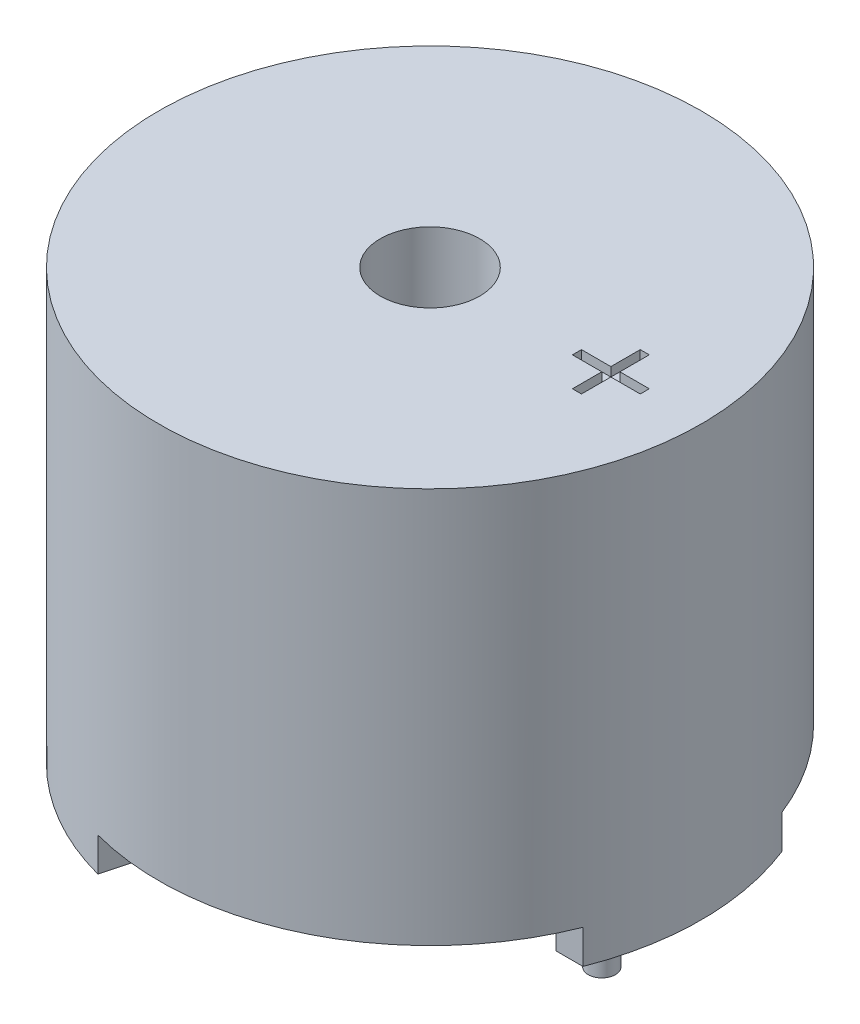
ISO-10303-21;
HEADER;
FILE_DESCRIPTION(('STEP AP214'),'2;1');
FILE_NAME('part.step','',(''),(''),'','','');
FILE_SCHEMA(('AUTOMOTIVE_DESIGN { 1 0 10303 214 1 1 1 1 }'));
ENDSEC;
DATA;
#1=APPLICATION_CONTEXT('core data for automotive mechanical design processes');
#2=APPLICATION_PROTOCOL_DEFINITION('international standard','automotive_design',2000,#1);
#3=PRODUCT_CONTEXT('',#1,'mechanical');
#4=PRODUCT('Part','Part','',(#3));
#5=PRODUCT_RELATED_PRODUCT_CATEGORY('part','',(#4));
#6=PRODUCT_DEFINITION_FORMATION('','',#4);
#7=PRODUCT_DEFINITION_CONTEXT('part definition',#1,'design');
#8=PRODUCT_DEFINITION('design','',#6,#7);
#9=PRODUCT_DEFINITION_SHAPE('','',#8);
#10=(LENGTH_UNIT() NAMED_UNIT(*) SI_UNIT(.MILLI.,.METRE.));
#11=(NAMED_UNIT(*) PLANE_ANGLE_UNIT() SI_UNIT($,.RADIAN.));
#12=(NAMED_UNIT(*) SI_UNIT($,.STERADIAN.) SOLID_ANGLE_UNIT());
#13=UNCERTAINTY_MEASURE_WITH_UNIT(LENGTH_MEASURE(1.E-05),#10,'distance_accuracy_value','');
#14=(GEOMETRIC_REPRESENTATION_CONTEXT(3) GLOBAL_UNCERTAINTY_ASSIGNED_CONTEXT((#13)) GLOBAL_UNIT_ASSIGNED_CONTEXT((#10,
#11,#12)) REPRESENTATION_CONTEXT('',''));
#15=CARTESIAN_POINT('',(0.,0.,0.));
#16=DIRECTION('',(0.,0.,1.));
#17=DIRECTION('',(1.,0.,0.));
#18=AXIS2_PLACEMENT_3D('',#15,#16,#17);
#19=CARTESIAN_POINT('',(0.,9.3,0.));
#20=DIRECTION('',(0.,1.,0.));
#21=DIRECTION('',(0.,0.,1.));
#22=AXIS2_PLACEMENT_3D('',#19,#20,#21);
#23=PLANE('',#22);
#24=DIRECTION('',(0.,0.,-1.));
#25=VECTOR('',#24,1.);
#26=CARTESIAN_POINT('',(4.1,9.3,0.75));
#27=LINE('',#26,#25);
#28=CARTESIAN_POINT('',(4.1,9.3,0.75));
#29=VERTEX_POINT('',#28);
#30=CARTESIAN_POINT('',(4.1,9.3,0.1));
#31=VERTEX_POINT('',#30);
#32=EDGE_CURVE('E268',#29,#31,#27,.T.);
#33=ORIENTED_EDGE('',*,*,#32,.T.);
#34=DIRECTION('',(1.,0.,0.));
#35=VECTOR('',#34,1.);
#36=CARTESIAN_POINT('',(4.75,9.3,0.1));
#37=LINE('',#36,#35);
#38=CARTESIAN_POINT('',(4.75,9.3,0.1));
#39=VERTEX_POINT('',#38);
#40=EDGE_CURVE('E273',#31,#39,#37,.T.);
#41=ORIENTED_EDGE('',*,*,#40,.T.);
#42=DIRECTION('',(0.,0.,-1.));
#43=VECTOR('',#42,1.);
#44=CARTESIAN_POINT('',(4.75,9.3,0.1));
#45=LINE('',#44,#43);
#46=CARTESIAN_POINT('',(4.75,9.3,-0.1));
#47=VERTEX_POINT('',#46);
#48=EDGE_CURVE('E275',#39,#47,#45,.T.);
#49=ORIENTED_EDGE('',*,*,#48,.T.);
#50=DIRECTION('',(-1.,0.,0.));
#51=VECTOR('',#50,1.);
#52=CARTESIAN_POINT('',(4.75,9.3,-0.1));
#53=LINE('',#52,#51);
#54=CARTESIAN_POINT('',(4.1,9.3,-0.1));
#55=VERTEX_POINT('',#54);
#56=EDGE_CURVE('E85',#47,#55,#53,.T.);
#57=ORIENTED_EDGE('',*,*,#56,.T.);
#58=DIRECTION('',(0.,0.,-1.));
#59=VECTOR('',#58,1.);
#60=CARTESIAN_POINT('',(4.1,9.3,-0.1));
#61=LINE('',#60,#59);
#62=CARTESIAN_POINT('',(4.1,9.3,-0.75));
#63=VERTEX_POINT('',#62);
#64=EDGE_CURVE('E228',#55,#63,#61,.T.);
#65=ORIENTED_EDGE('',*,*,#64,.T.);
#66=DIRECTION('',(-1.,0.,0.));
#67=VECTOR('',#66,1.);
#68=CARTESIAN_POINT('',(4.1,9.3,-0.75));
#69=LINE('',#68,#67);
#70=CARTESIAN_POINT('',(3.9,9.3,-0.75));
#71=VERTEX_POINT('',#70);
#72=EDGE_CURVE('E233',#63,#71,#69,.T.);
#73=ORIENTED_EDGE('',*,*,#72,.T.);
#74=DIRECTION('',(0.,0.,1.));
#75=VECTOR('',#74,1.);
#76=CARTESIAN_POINT('',(3.9,9.3,-0.1));
#77=LINE('',#76,#75);
#78=CARTESIAN_POINT('',(3.9,9.3,-0.1));
#79=VERTEX_POINT('',#78);
#80=EDGE_CURVE('E238',#71,#79,#77,.T.);
#81=ORIENTED_EDGE('',*,*,#80,.T.);
#82=DIRECTION('',(-1.,0.,0.));
#83=VECTOR('',#82,1.);
#84=CARTESIAN_POINT('',(3.9,9.3,-0.1));
#85=LINE('',#84,#83);
#86=CARTESIAN_POINT('',(3.25,9.3,-0.1));
#87=VERTEX_POINT('',#86);
#88=EDGE_CURVE('E243',#79,#87,#85,.T.);
#89=ORIENTED_EDGE('',*,*,#88,.T.);
#90=DIRECTION('',(0.,0.,1.));
#91=VECTOR('',#90,1.);
#92=CARTESIAN_POINT('',(3.25,9.3,0.1));
#93=LINE('',#92,#91);
#94=CARTESIAN_POINT('',(3.25,9.3,0.1));
#95=VERTEX_POINT('',#94);
#96=EDGE_CURVE('E248',#87,#95,#93,.T.);
#97=ORIENTED_EDGE('',*,*,#96,.T.);
#98=DIRECTION('',(1.,0.,0.));
#99=VECTOR('',#98,1.);
#100=CARTESIAN_POINT('',(3.9,9.3,0.1));
#101=LINE('',#100,#99);
#102=CARTESIAN_POINT('',(3.9,9.3,0.1));
#103=VERTEX_POINT('',#102);
#104=EDGE_CURVE('E253',#95,#103,#101,.T.);
#105=ORIENTED_EDGE('',*,*,#104,.T.);
#106=DIRECTION('',(0.,0.,1.));
#107=VECTOR('',#106,1.);
#108=CARTESIAN_POINT('',(3.9,9.3,0.75));
#109=LINE('',#108,#107);
#110=CARTESIAN_POINT('',(3.9,9.3,0.75));
#111=VERTEX_POINT('',#110);
#112=EDGE_CURVE('E258',#103,#111,#109,.T.);
#113=ORIENTED_EDGE('',*,*,#112,.T.);
#114=DIRECTION('',(1.,0.,0.));
#115=VECTOR('',#114,1.);
#116=CARTESIAN_POINT('',(4.1,9.3,0.75));
#117=LINE('',#116,#115);
#118=EDGE_CURVE('E263',#111,#29,#117,.T.);
#119=ORIENTED_EDGE('',*,*,#118,.T.);
#120=EDGE_LOOP('',(#33,#41,#49,#57,#65,#73,#81,#89,#97,#105,#113,#119));
#121=FACE_BOUND('',#120,.T.);
#122=ADVANCED_FACE('F19',(#121),#23,.T.);
#123=CARTESIAN_POINT('',(0.,6.5,0.));
#124=DIRECTION('',(0.,1.,0.));
#125=DIRECTION('',(0.,0.,1.));
#126=AXIS2_PLACEMENT_3D('',#123,#124,#125);
#127=PLANE('',#126);
#128=CARTESIAN_POINT('',(0.,6.5,0.));
#129=DIRECTION('',(0.,1.,0.));
#130=DIRECTION('',(0.,0.,1.));
#131=AXIS2_PLACEMENT_3D('',#128,#129,#130);
#132=CIRCLE('',#131,1.1);
#133=CARTESIAN_POINT('',(0.,6.5,1.1));
#134=VERTEX_POINT('',#133);
#135=EDGE_CURVE('E22',#134,#134,#132,.T.);
#136=ORIENTED_EDGE('',*,*,#135,.T.);
#137=EDGE_LOOP('',(#136));
#138=FACE_BOUND('',#137,.T.);
#139=ADVANCED_FACE('F321',(#138),#127,.T.);
#140=CARTESIAN_POINT('',(3.8,-2.,0.));
#141=DIRECTION('',(0.,-1.,0.));
#142=DIRECTION('',(0.,0.,-1.));
#143=AXIS2_PLACEMENT_3D('',#140,#141,#142);
#144=PLANE('',#143);
#145=CARTESIAN_POINT('',(3.8,-2.,0.));
#146=DIRECTION('',(0.,-1.,0.));
#147=DIRECTION('',(0.,0.,-1.));
#148=AXIS2_PLACEMENT_3D('',#145,#146,#147);
#149=CIRCLE('',#148,0.3);
#150=CARTESIAN_POINT('',(3.8,-2.,-0.3));
#151=VERTEX_POINT('',#150);
#152=EDGE_CURVE('E314',#151,#151,#149,.F.);
#153=ORIENTED_EDGE('',*,*,#152,.F.);
#154=EDGE_LOOP('',(#153));
#155=FACE_BOUND('',#154,.T.);
#156=ADVANCED_FACE('F631',(#155),#144,.T.);
#157=CARTESIAN_POINT('',(-3.8,-2.,0.));
#158=DIRECTION('',(0.,-1.,0.));
#159=DIRECTION('',(0.,0.,-1.));
#160=AXIS2_PLACEMENT_3D('',#157,#158,#159);
#161=PLANE('',#160);
#162=CARTESIAN_POINT('',(-3.8,-2.,0.));
#163=DIRECTION('',(0.,1.,0.));
#164=DIRECTION('',(0.,0.,1.));
#165=AXIS2_PLACEMENT_3D('',#162,#163,#164);
#166=CIRCLE('',#165,0.3);
#167=CARTESIAN_POINT('',(-3.8,-2.,0.299999999999999));
#168=VERTEX_POINT('',#167);
#169=EDGE_CURVE('E216',#168,#168,#166,.T.);
#170=ORIENTED_EDGE('',*,*,#169,.F.);
#171=EDGE_LOOP('',(#170));
#172=FACE_BOUND('',#171,.T.);
#173=ADVANCED_FACE('F622',(#172),#161,.T.);
#174=CARTESIAN_POINT('',(4.75,9.3,0.1));
#175=DIRECTION('',(1.,0.,0.));
#176=DIRECTION('',(0.,0.,-1.));
#177=AXIS2_PLACEMENT_3D('',#174,#175,#176);
#178=PLANE('',#177);
#179=DIRECTION('',(0.,1.,0.));
#180=VECTOR('',#179,1.);
#181=CARTESIAN_POINT('',(4.75,9.3,-0.1));
#182=LINE('',#181,#180);
#183=CARTESIAN_POINT('',(4.75,9.5,-0.1));
#184=VERTEX_POINT('',#183);
#185=EDGE_CURVE('E222',#184,#47,#182,.F.);
#186=ORIENTED_EDGE('',*,*,#185,.T.);
#187=ORIENTED_EDGE('',*,*,#48,.F.);
#188=DIRECTION('',(0.,1.,0.));
#189=VECTOR('',#188,1.);
#190=CARTESIAN_POINT('',(4.75,9.3,0.1));
#191=LINE('',#190,#189);
#192=CARTESIAN_POINT('',(4.75,9.5,0.1));
#193=VERTEX_POINT('',#192);
#194=EDGE_CURVE('E270',#39,#193,#191,.T.);
#195=ORIENTED_EDGE('',*,*,#194,.T.);
#196=DIRECTION('',(0.,0.,1.));
#197=VECTOR('',#196,1.);
#198=CARTESIAN_POINT('',(4.75,9.5,0.));
#199=LINE('',#198,#197);
#200=EDGE_CURVE('E166',#184,#193,#199,.T.);
#201=ORIENTED_EDGE('',*,*,#200,.F.);
#202=EDGE_LOOP('',(#186,#187,#195,#201));
#203=FACE_BOUND('',#202,.T.);
#204=ADVANCED_FACE('F613',(#203),#178,.F.);
#205=CARTESIAN_POINT('',(4.75,9.3,0.1));
#206=DIRECTION('',(0.,0.,1.));
#207=DIRECTION('',(1.,0.,0.));
#208=AXIS2_PLACEMENT_3D('',#205,#206,#207);
#209=PLANE('',#208);
#210=ORIENTED_EDGE('',*,*,#194,.F.);
#211=ORIENTED_EDGE('',*,*,#40,.F.);
#212=DIRECTION('',(0.,1.,0.));
#213=VECTOR('',#212,1.);
#214=CARTESIAN_POINT('',(4.1,9.3,0.1));
#215=LINE('',#214,#213);
#216=CARTESIAN_POINT('',(4.1,9.5,0.1));
#217=VERTEX_POINT('',#216);
#218=EDGE_CURVE('E265',#31,#217,#215,.T.);
#219=ORIENTED_EDGE('',*,*,#218,.T.);
#220=DIRECTION('',(1.,0.,0.));
#221=VECTOR('',#220,1.);
#222=CARTESIAN_POINT('',(0.,9.5,0.1));
#223=LINE('',#222,#221);
#224=EDGE_CURVE('E693',#193,#217,#223,.F.);
#225=ORIENTED_EDGE('',*,*,#224,.F.);
#226=EDGE_LOOP('',(#210,#211,#219,#225));
#227=FACE_BOUND('',#226,.T.);
#228=ADVANCED_FACE('F604',(#227),#209,.F.);
#229=CARTESIAN_POINT('',(4.1,9.3,0.75));
#230=DIRECTION('',(1.,0.,0.));
#231=DIRECTION('',(0.,0.,-1.));
#232=AXIS2_PLACEMENT_3D('',#229,#230,#231);
#233=PLANE('',#232);
#234=ORIENTED_EDGE('',*,*,#218,.F.);
#235=ORIENTED_EDGE('',*,*,#32,.F.);
#236=DIRECTION('',(0.,1.,0.));
#237=VECTOR('',#236,1.);
#238=CARTESIAN_POINT('',(4.1,9.3,0.75));
#239=LINE('',#238,#237);
#240=CARTESIAN_POINT('',(4.1,9.5,0.75));
#241=VERTEX_POINT('',#240);
#242=EDGE_CURVE('E260',#29,#241,#239,.T.);
#243=ORIENTED_EDGE('',*,*,#242,.T.);
#244=DIRECTION('',(0.,0.,1.));
#245=VECTOR('',#244,1.);
#246=CARTESIAN_POINT('',(4.1,9.5,0.));
#247=LINE('',#246,#245);
#248=EDGE_CURVE('E685',#217,#241,#247,.T.);
#249=ORIENTED_EDGE('',*,*,#248,.F.);
#250=EDGE_LOOP('',(#234,#235,#243,#249));
#251=FACE_BOUND('',#250,.T.);
#252=ADVANCED_FACE('F595',(#251),#233,.F.);
#253=CARTESIAN_POINT('',(4.1,9.3,0.75));
#254=DIRECTION('',(0.,0.,1.));
#255=DIRECTION('',(1.,0.,0.));
#256=AXIS2_PLACEMENT_3D('',#253,#254,#255);
#257=PLANE('',#256);
#258=ORIENTED_EDGE('',*,*,#242,.F.);
#259=ORIENTED_EDGE('',*,*,#118,.F.);
#260=DIRECTION('',(0.,1.,0.));
#261=VECTOR('',#260,1.);
#262=CARTESIAN_POINT('',(3.9,9.3,0.75));
#263=LINE('',#262,#261);
#264=CARTESIAN_POINT('',(3.9,9.5,0.75));
#265=VERTEX_POINT('',#264);
#266=EDGE_CURVE('E255',#111,#265,#263,.T.);
#267=ORIENTED_EDGE('',*,*,#266,.T.);
#268=DIRECTION('',(1.,0.,0.));
#269=VECTOR('',#268,1.);
#270=CARTESIAN_POINT('',(0.,9.5,0.75));
#271=LINE('',#270,#269);
#272=EDGE_CURVE('E692',#241,#265,#271,.F.);
#273=ORIENTED_EDGE('',*,*,#272,.F.);
#274=EDGE_LOOP('',(#258,#259,#267,#273));
#275=FACE_BOUND('',#274,.T.);
#276=ADVANCED_FACE('F586',(#275),#257,.F.);
#277=CARTESIAN_POINT('',(3.9,9.3,0.75));
#278=DIRECTION('',(-1.,0.,0.));
#279=DIRECTION('',(0.,0.,1.));
#280=AXIS2_PLACEMENT_3D('',#277,#278,#279);
#281=PLANE('',#280);
#282=ORIENTED_EDGE('',*,*,#266,.F.);
#283=ORIENTED_EDGE('',*,*,#112,.F.);
#284=DIRECTION('',(0.,1.,0.));
#285=VECTOR('',#284,1.);
#286=CARTESIAN_POINT('',(3.9,9.3,0.1));
#287=LINE('',#286,#285);
#288=CARTESIAN_POINT('',(3.9,9.5,0.1));
#289=VERTEX_POINT('',#288);
#290=EDGE_CURVE('E250',#103,#289,#287,.T.);
#291=ORIENTED_EDGE('',*,*,#290,.T.);
#292=DIRECTION('',(0.,0.,1.));
#293=VECTOR('',#292,1.);
#294=CARTESIAN_POINT('',(3.9,9.5,0.));
#295=LINE('',#294,#293);
#296=EDGE_CURVE('E700',#265,#289,#295,.F.);
#297=ORIENTED_EDGE('',*,*,#296,.F.);
#298=EDGE_LOOP('',(#282,#283,#291,#297));
#299=FACE_BOUND('',#298,.T.);
#300=ADVANCED_FACE('F577',(#299),#281,.F.);
#301=CARTESIAN_POINT('',(3.9,9.3,0.1));
#302=DIRECTION('',(0.,0.,1.));
#303=DIRECTION('',(1.,0.,0.));
#304=AXIS2_PLACEMENT_3D('',#301,#302,#303);
#305=PLANE('',#304);
#306=ORIENTED_EDGE('',*,*,#290,.F.);
#307=ORIENTED_EDGE('',*,*,#104,.F.);
#308=DIRECTION('',(0.,1.,0.));
#309=VECTOR('',#308,1.);
#310=CARTESIAN_POINT('',(3.25,9.3,0.1));
#311=LINE('',#310,#309);
#312=CARTESIAN_POINT('',(3.25,9.5,0.1));
#313=VERTEX_POINT('',#312);
#314=EDGE_CURVE('E245',#95,#313,#311,.T.);
#315=ORIENTED_EDGE('',*,*,#314,.T.);
#316=DIRECTION('',(1.,0.,0.));
#317=VECTOR('',#316,1.);
#318=CARTESIAN_POINT('',(0.,9.5,0.1));
#319=LINE('',#318,#317);
#320=EDGE_CURVE('E703',#289,#313,#319,.F.);
#321=ORIENTED_EDGE('',*,*,#320,.F.);
#322=EDGE_LOOP('',(#306,#307,#315,#321));
#323=FACE_BOUND('',#322,.T.);
#324=ADVANCED_FACE('F568',(#323),#305,.F.);
#325=CARTESIAN_POINT('',(3.25,9.3,0.1));
#326=DIRECTION('',(-1.,0.,0.));
#327=DIRECTION('',(0.,0.,1.));
#328=AXIS2_PLACEMENT_3D('',#325,#326,#327);
#329=PLANE('',#328);
#330=ORIENTED_EDGE('',*,*,#314,.F.);
#331=ORIENTED_EDGE('',*,*,#96,.F.);
#332=DIRECTION('',(0.,1.,0.));
#333=VECTOR('',#332,1.);
#334=CARTESIAN_POINT('',(3.25,9.3,-0.0999999999999999));
#335=LINE('',#334,#333);
#336=CARTESIAN_POINT('',(3.25,9.5,-0.1));
#337=VERTEX_POINT('',#336);
#338=EDGE_CURVE('E240',#87,#337,#335,.T.);
#339=ORIENTED_EDGE('',*,*,#338,.T.);
#340=DIRECTION('',(0.,0.,1.));
#341=VECTOR('',#340,1.);
#342=CARTESIAN_POINT('',(3.25,9.5,0.));
#343=LINE('',#342,#341);
#344=EDGE_CURVE('E706',#313,#337,#343,.F.);
#345=ORIENTED_EDGE('',*,*,#344,.F.);
#346=EDGE_LOOP('',(#330,#331,#339,#345));
#347=FACE_BOUND('',#346,.T.);
#348=ADVANCED_FACE('F559',(#347),#329,.F.);
#349=CARTESIAN_POINT('',(3.9,9.3,-0.1));
#350=DIRECTION('',(0.,0.,-1.));
#351=DIRECTION('',(-1.,0.,0.));
#352=AXIS2_PLACEMENT_3D('',#349,#350,#351);
#353=PLANE('',#352);
#354=ORIENTED_EDGE('',*,*,#338,.F.);
#355=ORIENTED_EDGE('',*,*,#88,.F.);
#356=DIRECTION('',(0.,1.,0.));
#357=VECTOR('',#356,1.);
#358=CARTESIAN_POINT('',(3.9,9.3,-0.1));
#359=LINE('',#358,#357);
#360=CARTESIAN_POINT('',(3.9,9.5,-0.1));
#361=VERTEX_POINT('',#360);
#362=EDGE_CURVE('E235',#79,#361,#359,.T.);
#363=ORIENTED_EDGE('',*,*,#362,.T.);
#364=DIRECTION('',(1.,0.,0.));
#365=VECTOR('',#364,1.);
#366=CARTESIAN_POINT('',(0.,9.5,-0.1));
#367=LINE('',#366,#365);
#368=EDGE_CURVE('E709',#337,#361,#367,.T.);
#369=ORIENTED_EDGE('',*,*,#368,.F.);
#370=EDGE_LOOP('',(#354,#355,#363,#369));
#371=FACE_BOUND('',#370,.T.);
#372=ADVANCED_FACE('F550',(#371),#353,.F.);
#373=CARTESIAN_POINT('',(3.9,9.3,-0.1));
#374=DIRECTION('',(-1.,0.,0.));
#375=DIRECTION('',(0.,0.,1.));
#376=AXIS2_PLACEMENT_3D('',#373,#374,#375);
#377=PLANE('',#376);
#378=ORIENTED_EDGE('',*,*,#362,.F.);
#379=ORIENTED_EDGE('',*,*,#80,.F.);
#380=DIRECTION('',(0.,1.,0.));
#381=VECTOR('',#380,1.);
#382=CARTESIAN_POINT('',(3.9,9.3,-0.75));
#383=LINE('',#382,#381);
#384=CARTESIAN_POINT('',(3.9,9.5,-0.75));
#385=VERTEX_POINT('',#384);
#386=EDGE_CURVE('E230',#71,#385,#383,.T.);
#387=ORIENTED_EDGE('',*,*,#386,.T.);
#388=DIRECTION('',(0.,0.,1.));
#389=VECTOR('',#388,1.);
#390=CARTESIAN_POINT('',(3.9,9.5,0.));
#391=LINE('',#390,#389);
#392=EDGE_CURVE('E712',#361,#385,#391,.F.);
#393=ORIENTED_EDGE('',*,*,#392,.F.);
#394=EDGE_LOOP('',(#378,#379,#387,#393));
#395=FACE_BOUND('',#394,.T.);
#396=ADVANCED_FACE('F541',(#395),#377,.F.);
#397=CARTESIAN_POINT('',(4.1,9.3,-0.75));
#398=DIRECTION('',(0.,0.,-1.));
#399=DIRECTION('',(-1.,0.,0.));
#400=AXIS2_PLACEMENT_3D('',#397,#398,#399);
#401=PLANE('',#400);
#402=ORIENTED_EDGE('',*,*,#386,.F.);
#403=ORIENTED_EDGE('',*,*,#72,.F.);
#404=DIRECTION('',(0.,1.,0.));
#405=VECTOR('',#404,1.);
#406=CARTESIAN_POINT('',(4.1,9.3,-0.75));
#407=LINE('',#406,#405);
#408=CARTESIAN_POINT('',(4.1,9.5,-0.75));
#409=VERTEX_POINT('',#408);
#410=EDGE_CURVE('E225',#63,#409,#407,.T.);
#411=ORIENTED_EDGE('',*,*,#410,.T.);
#412=DIRECTION('',(1.,0.,0.));
#413=VECTOR('',#412,1.);
#414=CARTESIAN_POINT('',(0.,9.5,-0.75));
#415=LINE('',#414,#413);
#416=EDGE_CURVE('E715',#385,#409,#415,.T.);
#417=ORIENTED_EDGE('',*,*,#416,.F.);
#418=EDGE_LOOP('',(#402,#403,#411,#417));
#419=FACE_BOUND('',#418,.T.);
#420=ADVANCED_FACE('F532',(#419),#401,.F.);
#421=CARTESIAN_POINT('',(4.1,9.3,-0.1));
#422=DIRECTION('',(1.,0.,0.));
#423=DIRECTION('',(0.,0.,-1.));
#424=AXIS2_PLACEMENT_3D('',#421,#422,#423);
#425=PLANE('',#424);
#426=ORIENTED_EDGE('',*,*,#410,.F.);
#427=ORIENTED_EDGE('',*,*,#64,.F.);
#428=DIRECTION('',(0.,1.,0.));
#429=VECTOR('',#428,1.);
#430=CARTESIAN_POINT('',(4.1,9.3,-0.1));
#431=LINE('',#430,#429);
#432=CARTESIAN_POINT('',(4.1,9.5,-0.1));
#433=VERTEX_POINT('',#432);
#434=EDGE_CURVE('E218',#55,#433,#431,.T.);
#435=ORIENTED_EDGE('',*,*,#434,.T.);
#436=DIRECTION('',(0.,0.,1.));
#437=VECTOR('',#436,1.);
#438=CARTESIAN_POINT('',(4.1,9.5,0.));
#439=LINE('',#438,#437);
#440=EDGE_CURVE('E718',#409,#433,#439,.T.);
#441=ORIENTED_EDGE('',*,*,#440,.F.);
#442=EDGE_LOOP('',(#426,#427,#435,#441));
#443=FACE_BOUND('',#442,.T.);
#444=ADVANCED_FACE('F336',(#443),#425,.F.);
#445=CARTESIAN_POINT('',(4.75,9.3,-0.1));
#446=DIRECTION('',(0.,0.,-1.));
#447=DIRECTION('',(-1.,0.,0.));
#448=AXIS2_PLACEMENT_3D('',#445,#446,#447);
#449=PLANE('',#448);
#450=ORIENTED_EDGE('',*,*,#434,.F.);
#451=ORIENTED_EDGE('',*,*,#56,.F.);
#452=ORIENTED_EDGE('',*,*,#185,.F.);
#453=DIRECTION('',(1.,0.,0.));
#454=VECTOR('',#453,1.);
#455=CARTESIAN_POINT('',(0.,9.5,-0.1));
#456=LINE('',#455,#454);
#457=EDGE_CURVE('E311',#433,#184,#456,.T.);
#458=ORIENTED_EDGE('',*,*,#457,.F.);
#459=EDGE_LOOP('',(#450,#451,#452,#458));
#460=FACE_BOUND('',#459,.T.);
#461=ADVANCED_FACE('F326',(#460),#449,.F.);
#462=CARTESIAN_POINT('',(0.,6.5,0.));
#463=DIRECTION('',(0.,1.,0.));
#464=DIRECTION('',(0.,0.,1.));
#465=AXIS2_PLACEMENT_3D('',#462,#463,#464);
#466=CYLINDRICAL_SURFACE('',#465,1.1);
#467=CARTESIAN_POINT('',(0.,9.5,0.));
#468=DIRECTION('',(0.,1.,0.));
#469=DIRECTION('',(0.,0.,1.));
#470=AXIS2_PLACEMENT_3D('',#467,#468,#469);
#471=CIRCLE('',#470,1.1);
#472=CARTESIAN_POINT('',(0.,9.5,1.1));
#473=VERTEX_POINT('',#472);
#474=EDGE_CURVE('E214',#473,#473,#471,.F.);
#475=ORIENTED_EDGE('',*,*,#474,.F.);
#476=EDGE_LOOP('',(#475));
#477=FACE_BOUND('',#476,.T.);
#478=ORIENTED_EDGE('',*,*,#135,.F.);
#479=EDGE_LOOP('',(#478));
#480=FACE_BOUND('',#479,.T.);
#481=ADVANCED_FACE('F323',(#477,#480),#466,.F.);
#482=CARTESIAN_POINT('',(0.,0.,0.));
#483=DIRECTION('',(0.,1.,0.));
#484=DIRECTION('',(0.,0.,1.));
#485=AXIS2_PLACEMENT_3D('',#482,#483,#484);
#486=PLANE('',#485);
#487=CARTESIAN_POINT('',(0.,0.,0.));
#488=DIRECTION('',(0.,-1.,0.));
#489=DIRECTION('',(0.,0.,-1.));
#490=AXIS2_PLACEMENT_3D('',#487,#488,#489);
#491=CIRCLE('',#490,5.446233822217);
#492=CARTESIAN_POINT('',(4.98211429478096,0.,2.2));
#493=VERTEX_POINT('',#492);
#494=CARTESIAN_POINT('',(4.98211429478093,0.,-2.19999999999999));
#495=VERTEX_POINT('',#494);
#496=EDGE_CURVE('E198',#493,#495,#491,.F.);
#497=ORIENTED_EDGE('',*,*,#496,.T.);
#498=DIRECTION('',(-1.,0.,0.));
#499=VECTOR('',#498,1.);
#500=CARTESIAN_POINT('',(5.582114294781,0.,-2.2));
#501=LINE('',#500,#499);
#502=CARTESIAN_POINT('',(5.58211429478114,0.,-2.20000000000003));
#503=VERTEX_POINT('',#502);
#504=EDGE_CURVE('E77',#503,#495,#501,.T.);
#505=ORIENTED_EDGE('',*,*,#504,.F.);
#506=CARTESIAN_POINT('',(0.,0.,0.));
#507=DIRECTION('',(0.,-1.,0.));
#508=DIRECTION('',(0.,0.,-1.));
#509=AXIS2_PLACEMENT_3D('',#506,#507,#508);
#510=CIRCLE('',#509,6.);
#511=CARTESIAN_POINT('',(5.58211429478114,0.,2.20000000000002));
#512=VERTEX_POINT('',#511);
#513=EDGE_CURVE('E203',#512,#503,#510,.F.);
#514=ORIENTED_EDGE('',*,*,#513,.F.);
#515=DIRECTION('',(1.,0.,0.));
#516=VECTOR('',#515,1.);
#517=CARTESIAN_POINT('',(5.582114294781,0.,2.2));
#518=LINE('',#517,#516);
#519=EDGE_CURVE('E67',#493,#512,#518,.T.);
#520=ORIENTED_EDGE('',*,*,#519,.F.);
#521=EDGE_LOOP('',(#497,#505,#514,#520));
#522=FACE_BOUND('',#521,.T.);
#523=ADVANCED_FACE('F325',(#522),#486,.F.);
#524=CARTESIAN_POINT('',(3.8,1.598528137424,0.));
#525=DIRECTION('',(0.,-1.,0.));
#526=DIRECTION('',(0.,0.,-1.));
#527=AXIS2_PLACEMENT_3D('',#524,#525,#526);
#528=CYLINDRICAL_SURFACE('',#527,0.3);
#529=CARTESIAN_POINT('',(3.8,0.75,0.));
#530=DIRECTION('',(0.,-1.,0.));
#531=DIRECTION('',(0.,0.,-1.));
#532=AXIS2_PLACEMENT_3D('',#529,#530,#531);
#533=CIRCLE('',#532,0.3);
#534=CARTESIAN_POINT('',(3.8,0.75,-0.3));
#535=VERTEX_POINT('',#534);
#536=EDGE_CURVE('E209',#535,#535,#533,.F.);
#537=ORIENTED_EDGE('',*,*,#536,.F.);
#538=EDGE_LOOP('',(#537));
#539=FACE_BOUND('',#538,.T.);
#540=ORIENTED_EDGE('',*,*,#152,.T.);
#541=EDGE_LOOP('',(#540));
#542=FACE_BOUND('',#541,.T.);
#543=ADVANCED_FACE('F334',(#539,#542),#528,.T.);
#544=CARTESIAN_POINT('',(-3.8,-2.,0.));
#545=DIRECTION('',(0.,1.,0.));
#546=DIRECTION('',(0.,0.,1.));
#547=AXIS2_PLACEMENT_3D('',#544,#545,#546);
#548=CYLINDRICAL_SURFACE('',#547,0.3);
#549=CARTESIAN_POINT('',(-3.8,0.75,0.));
#550=DIRECTION('',(0.,1.,0.));
#551=DIRECTION('',(0.,0.,1.));
#552=AXIS2_PLACEMENT_3D('',#549,#550,#551);
#553=CIRCLE('',#552,0.3);
#554=CARTESIAN_POINT('',(-3.8,0.75,0.299999999999999));
#555=VERTEX_POINT('',#554);
#556=EDGE_CURVE('E300',#555,#555,#553,.T.);
#557=ORIENTED_EDGE('',*,*,#556,.F.);
#558=EDGE_LOOP('',(#557));
#559=FACE_BOUND('',#558,.T.);
#560=ORIENTED_EDGE('',*,*,#169,.T.);
#561=EDGE_LOOP('',(#560));
#562=FACE_BOUND('',#561,.T.);
#563=ADVANCED_FACE('F392',(#559,#562),#548,.T.);
#564=CARTESIAN_POINT('',(0.,0.75,0.));
#565=DIRECTION('',(0.,-1.,0.));
#566=DIRECTION('',(0.,0.,-1.));
#567=AXIS2_PLACEMENT_3D('',#564,#565,#566);
#568=CYLINDRICAL_SURFACE('',#567,5.4);
#569=DIRECTION('',(0.,1.,0.));
#570=VECTOR('',#569,1.);
#571=CARTESIAN_POINT('',(-1.39762284355335,0.75,-5.21599946196117));
#572=LINE('',#571,#570);
#573=CARTESIAN_POINT('',(-1.39762284355366,0.75,-5.21599946196102));
#574=VERTEX_POINT('',#573);
#575=CARTESIAN_POINT('',(-1.39762284355366,0.,-5.21599946196102));
#576=VERTEX_POINT('',#575);
#577=EDGE_CURVE('E202',#574,#576,#572,.F.);
#578=ORIENTED_EDGE('',*,*,#577,.F.);
#579=CARTESIAN_POINT('',(0.,0.75,0.));
#580=DIRECTION('',(0.,-1.,0.));
#581=DIRECTION('',(0.,0.,-1.));
#582=AXIS2_PLACEMENT_3D('',#579,#580,#581);
#583=CIRCLE('',#582,5.4);
#584=CARTESIAN_POINT('',(-3.81837661840718,0.75,-3.81837661840718));
#585=VERTEX_POINT('',#584);
#586=EDGE_CURVE('E295',#585,#574,#583,.T.);
#587=ORIENTED_EDGE('',*,*,#586,.F.);
#588=DIRECTION('',(0.,1.,0.));
#589=VECTOR('',#588,1.);
#590=CARTESIAN_POINT('',(-3.818376618407,0.75,-3.818376618407));
#591=LINE('',#590,#589);
#592=CARTESIAN_POINT('',(-3.81837661840718,0.,-3.81837661840718));
#593=VERTEX_POINT('',#592);
#594=EDGE_CURVE('E207',#593,#585,#591,.T.);
#595=ORIENTED_EDGE('',*,*,#594,.F.);
#596=CARTESIAN_POINT('',(0.,0.,0.));
#597=DIRECTION('',(0.,-1.,0.));
#598=DIRECTION('',(0.,0.,-1.));
#599=AXIS2_PLACEMENT_3D('',#596,#597,#598);
#600=CIRCLE('',#599,5.4);
#601=EDGE_CURVE('E206',#593,#576,#600,.T.);
#602=ORIENTED_EDGE('',*,*,#601,.T.);
#603=EDGE_LOOP('',(#578,#587,#595,#602));
#604=FACE_BOUND('',#603,.T.);
#605=ADVANCED_FACE('F389',(#604),#568,.F.);
#606=CARTESIAN_POINT('',(5.582114294781,0.75,-2.2));
#607=DIRECTION('',(0.,0.,-1.));
#608=DIRECTION('',(-1.,0.,0.));
#609=AXIS2_PLACEMENT_3D('',#606,#607,#608);
#610=PLANE('',#609);
#611=DIRECTION('',(1.,0.,0.));
#612=VECTOR('',#611,1.);
#613=CARTESIAN_POINT('',(0.274198215041,0.75,-2.2));
#614=LINE('',#613,#612);
#615=CARTESIAN_POINT('',(5.58211429478114,0.750000000000001,-2.20000000000003));
#616=VERTEX_POINT('',#615);
#617=CARTESIAN_POINT('',(4.98211429478093,0.75,-2.19999999999999));
#618=VERTEX_POINT('',#617);
#619=EDGE_CURVE('E294',#616,#618,#614,.F.);
#620=ORIENTED_EDGE('',*,*,#619,.F.);
#621=DIRECTION('',(0.,-1.,0.));
#622=VECTOR('',#621,1.);
#623=CARTESIAN_POINT('',(5.58211429478113,9.5,-2.20000000000005));
#624=LINE('',#623,#622);
#625=EDGE_CURVE('E199',#503,#616,#624,.F.);
#626=ORIENTED_EDGE('',*,*,#625,.F.);
#627=ORIENTED_EDGE('',*,*,#504,.T.);
#628=DIRECTION('',(0.,-1.,0.));
#629=VECTOR('',#628,1.);
#630=CARTESIAN_POINT('',(4.98211429478093,0.75,-2.19999999999997));
#631=LINE('',#630,#629);
#632=EDGE_CURVE('E196',#495,#618,#631,.F.);
#633=ORIENTED_EDGE('',*,*,#632,.T.);
#634=EDGE_LOOP('',(#620,#626,#627,#633));
#635=FACE_BOUND('',#634,.T.);
#636=ADVANCED_FACE('F385',(#635),#610,.T.);
#637=CARTESIAN_POINT('',(0.,0.75,0.));
#638=DIRECTION('',(0.,-1.,0.));
#639=DIRECTION('',(0.,0.,-1.));
#640=AXIS2_PLACEMENT_3D('',#637,#638,#639);
#641=CYLINDRICAL_SURFACE('',#640,5.446233822217);
#642=DIRECTION('',(0.,1.,0.));
#643=VECTOR('',#642,1.);
#644=CARTESIAN_POINT('',(4.982114294781,0.75,2.2));
#645=LINE('',#644,#643);
#646=CARTESIAN_POINT('',(4.98211429478096,0.75,2.2));
#647=VERTEX_POINT('',#646);
#648=EDGE_CURVE('E167',#647,#493,#645,.F.);
#649=ORIENTED_EDGE('',*,*,#648,.F.);
#650=CARTESIAN_POINT('',(0.,0.75,0.));
#651=DIRECTION('',(0.,-1.,0.));
#652=DIRECTION('',(0.,0.,-1.));
#653=AXIS2_PLACEMENT_3D('',#650,#651,#652);
#654=CIRCLE('',#653,5.446233822217);
#655=EDGE_CURVE('E291',#618,#647,#654,.T.);
#656=ORIENTED_EDGE('',*,*,#655,.F.);
#657=ORIENTED_EDGE('',*,*,#632,.F.);
#658=ORIENTED_EDGE('',*,*,#496,.F.);
#659=EDGE_LOOP('',(#649,#656,#657,#658));
#660=FACE_BOUND('',#659,.T.);
#661=ADVANCED_FACE('F381',(#660),#641,.F.);
#662=CARTESIAN_POINT('',(5.582114294781,0.75,2.2));
#663=DIRECTION('',(0.,0.,1.));
#664=DIRECTION('',(1.,0.,0.));
#665=AXIS2_PLACEMENT_3D('',#662,#663,#664);
#666=PLANE('',#665);
#667=DIRECTION('',(1.,0.,0.));
#668=VECTOR('',#667,1.);
#669=CARTESIAN_POINT('',(0.274198215041,0.75,2.2));
#670=LINE('',#669,#668);
#671=CARTESIAN_POINT('',(5.58211429478114,0.750000000000001,2.20000000000002));
#672=VERTEX_POINT('',#671);
#673=EDGE_CURVE('E293',#647,#672,#670,.T.);
#674=ORIENTED_EDGE('',*,*,#673,.F.);
#675=ORIENTED_EDGE('',*,*,#648,.T.);
#676=ORIENTED_EDGE('',*,*,#519,.T.);
#677=DIRECTION('',(0.,-1.,0.));
#678=VECTOR('',#677,1.);
#679=CARTESIAN_POINT('',(5.58211429478113,9.5,2.20000000000005));
#680=LINE('',#679,#678);
#681=EDGE_CURVE('E211',#672,#512,#680,.T.);
#682=ORIENTED_EDGE('',*,*,#681,.F.);
#683=EDGE_LOOP('',(#674,#675,#676,#682));
#684=FACE_BOUND('',#683,.T.);
#685=ADVANCED_FACE('F378',(#684),#666,.T.);
#686=CARTESIAN_POINT('',(0.,0.75,0.));
#687=DIRECTION('',(0.,-1.,0.));
#688=DIRECTION('',(0.,0.,-1.));
#689=AXIS2_PLACEMENT_3D('',#686,#687,#688);
#690=CYLINDRICAL_SURFACE('',#689,5.4);
#691=DIRECTION('',(0.,1.,0.));
#692=VECTOR('',#691,1.);
#693=CARTESIAN_POINT('',(-3.818376618407,0.75,3.818376618407));
#694=LINE('',#693,#692);
#695=CARTESIAN_POINT('',(-3.81837661840718,0.75,3.81837661840718));
#696=VERTEX_POINT('',#695);
#697=CARTESIAN_POINT('',(-3.81837661840718,0.,3.81837661840718));
#698=VERTEX_POINT('',#697);
#699=EDGE_CURVE('E174',#696,#698,#694,.F.);
#700=ORIENTED_EDGE('',*,*,#699,.F.);
#701=CARTESIAN_POINT('',(0.,0.75,0.));
#702=DIRECTION('',(0.,-1.,0.));
#703=DIRECTION('',(0.,0.,-1.));
#704=AXIS2_PLACEMENT_3D('',#701,#702,#703);
#705=CIRCLE('',#704,5.4);
#706=CARTESIAN_POINT('',(-1.39762284355364,0.75,5.21599946196096));
#707=VERTEX_POINT('',#706);
#708=EDGE_CURVE('E171',#707,#696,#705,.T.);
#709=ORIENTED_EDGE('',*,*,#708,.F.);
#710=DIRECTION('',(0.,-1.,0.));
#711=VECTOR('',#710,1.);
#712=CARTESIAN_POINT('',(-1.39762284355396,0.75,5.21599946196087));
#713=LINE('',#712,#711);
#714=CARTESIAN_POINT('',(-1.39762284355364,0.,5.21599946196096));
#715=VERTEX_POINT('',#714);
#716=EDGE_CURVE('E158',#715,#707,#713,.F.);
#717=ORIENTED_EDGE('',*,*,#716,.F.);
#718=CARTESIAN_POINT('',(0.,0.,0.));
#719=DIRECTION('',(0.,-1.,0.));
#720=DIRECTION('',(0.,0.,-1.));
#721=AXIS2_PLACEMENT_3D('',#718,#719,#720);
#722=CIRCLE('',#721,5.4);
#723=EDGE_CURVE('E191',#715,#698,#722,.T.);
#724=ORIENTED_EDGE('',*,*,#723,.T.);
#725=EDGE_LOOP('',(#700,#709,#717,#724));
#726=FACE_BOUND('',#725,.T.);
#727=ADVANCED_FACE('F172',(#726),#690,.F.);
#728=CARTESIAN_POINT('',(0.,9.5,0.));
#729=DIRECTION('',(0.,1.,0.));
#730=DIRECTION('',(0.,0.,1.));
#731=AXIS2_PLACEMENT_3D('',#728,#729,#730);
#732=PLANE('',#731);
#733=CARTESIAN_POINT('',(0.,9.5,0.));
#734=DIRECTION('',(0.,-1.,0.));
#735=DIRECTION('',(0.,0.,-1.));
#736=AXIS2_PLACEMENT_3D('',#733,#734,#735);
#737=CIRCLE('',#736,6.);
#738=CARTESIAN_POINT('',(0.,9.5,-6.));
#739=VERTEX_POINT('',#738);
#740=EDGE_CURVE('E181',#739,#739,#737,.T.);
#741=ORIENTED_EDGE('',*,*,#740,.F.);
#742=EDGE_LOOP('',(#741));
#743=FACE_BOUND('',#742,.T.);
#744=ORIENTED_EDGE('',*,*,#474,.T.);
#745=EDGE_LOOP('',(#744));
#746=FACE_BOUND('',#745,.T.);
#747=ORIENTED_EDGE('',*,*,#440,.T.);
#748=ORIENTED_EDGE('',*,*,#457,.T.);
#749=ORIENTED_EDGE('',*,*,#200,.T.);
#750=ORIENTED_EDGE('',*,*,#224,.T.);
#751=ORIENTED_EDGE('',*,*,#248,.T.);
#752=ORIENTED_EDGE('',*,*,#272,.T.);
#753=ORIENTED_EDGE('',*,*,#296,.T.);
#754=ORIENTED_EDGE('',*,*,#320,.T.);
#755=ORIENTED_EDGE('',*,*,#344,.T.);
#756=ORIENTED_EDGE('',*,*,#368,.T.);
#757=ORIENTED_EDGE('',*,*,#392,.T.);
#758=ORIENTED_EDGE('',*,*,#416,.T.);
#759=EDGE_LOOP('',(#747,#748,#749,#750,#751,#752,#753,#754,#755,#756,#757,#758));
#760=FACE_BOUND('',#759,.T.);
#761=ADVANCED_FACE('F371',(#743,#746,#760),#732,.T.);
#762=CARTESIAN_POINT('',(-1.552914270615,0.75,-5.795554957734));
#763=DIRECTION('',(0.965925826288944,0.,-0.258819045102985));
#764=DIRECTION('',(-0.258819045102985,0.,-0.965925826288944));
#765=AXIS2_PLACEMENT_3D('',#762,#763,#764);
#766=PLANE('',#765);
#767=DIRECTION('',(-0.258819045101908,0.,-0.965925826289232));
#768=VECTOR('',#767,1.);
#769=CARTESIAN_POINT('',(-1.397622843554,0.75,-5.215999461961));
#770=LINE('',#769,#768);
#771=CARTESIAN_POINT('',(-1.55291427061511,0.750000000000001,-5.79555495773441));
#772=VERTEX_POINT('',#771);
#773=EDGE_CURVE('E297',#574,#772,#770,.T.);
#774=ORIENTED_EDGE('',*,*,#773,.F.);
#775=ORIENTED_EDGE('',*,*,#577,.T.);
#776=DIRECTION('',(-0.258819045101908,0.,-0.965925826289232));
#777=VECTOR('',#776,1.);
#778=CARTESIAN_POINT('',(-1.397622843554,0.,-5.215999461961));
#779=LINE('',#778,#777);
#780=CARTESIAN_POINT('',(-1.55291427061511,0.,-5.79555495773441));
#781=VERTEX_POINT('',#780);
#782=EDGE_CURVE('E306',#576,#781,#779,.T.);
#783=ORIENTED_EDGE('',*,*,#782,.T.);
#784=DIRECTION('',(0.,-1.,0.));
#785=VECTOR('',#784,1.);
#786=CARTESIAN_POINT('',(-1.55291427061511,9.5,-5.79555495773441));
#787=LINE('',#786,#785);
#788=EDGE_CURVE('E287',#772,#781,#787,.T.);
#789=ORIENTED_EDGE('',*,*,#788,.F.);
#790=EDGE_LOOP('',(#774,#775,#783,#789));
#791=FACE_BOUND('',#790,.T.);
#792=ADVANCED_FACE('F367',(#791),#766,.T.);
#793=CARTESIAN_POINT('',(0.,0.,0.));
#794=DIRECTION('',(0.,1.,0.));
#795=DIRECTION('',(0.,0.,1.));
#796=AXIS2_PLACEMENT_3D('',#793,#794,#795);
#797=PLANE('',#796);
#798=CARTESIAN_POINT('',(0.,0.,0.));
#799=DIRECTION('',(0.,-1.,0.));
#800=DIRECTION('',(0.,0.,-1.));
#801=AXIS2_PLACEMENT_3D('',#798,#799,#800);
#802=CIRCLE('',#801,6.);
#803=CARTESIAN_POINT('',(-4.24264068711929,0.,-4.24264068711928));
#804=VERTEX_POINT('',#803);
#805=EDGE_CURVE('E284',#781,#804,#802,.F.);
#806=ORIENTED_EDGE('',*,*,#805,.F.);
#807=ORIENTED_EDGE('',*,*,#782,.F.);
#808=ORIENTED_EDGE('',*,*,#601,.F.);
#809=DIRECTION('',(0.707106781186548,0.,0.707106781186548));
#810=VECTOR('',#809,1.);
#811=CARTESIAN_POINT('',(-3.818376618407,0.,-3.818376618407));
#812=LINE('',#811,#810);
#813=EDGE_CURVE('E210',#804,#593,#812,.T.);
#814=ORIENTED_EDGE('',*,*,#813,.F.);
#815=EDGE_LOOP('',(#806,#807,#808,#814));
#816=FACE_BOUND('',#815,.T.);
#817=ADVANCED_FACE('F363',(#816),#797,.F.);
#818=CARTESIAN_POINT('',(-3.818376618407,0.75,-3.818376618407));
#819=DIRECTION('',(-0.707106781186548,0.,0.707106781186548));
#820=DIRECTION('',(0.707106781186548,0.,0.707106781186548));
#821=AXIS2_PLACEMENT_3D('',#818,#819,#820);
#822=PLANE('',#821);
#823=DIRECTION('',(0.707106781186548,0.,0.707106781186547));
#824=VECTOR('',#823,1.);
#825=CARTESIAN_POINT('',(-4.242640687119,0.75,-4.242640687119));
#826=LINE('',#825,#824);
#827=CARTESIAN_POINT('',(-4.24264068711929,0.750000000000001,-4.24264068711928));
#828=VERTEX_POINT('',#827);
#829=EDGE_CURVE('E176',#828,#585,#826,.T.);
#830=ORIENTED_EDGE('',*,*,#829,.F.);
#831=DIRECTION('',(0.,-1.,0.));
#832=VECTOR('',#831,1.);
#833=CARTESIAN_POINT('',(-4.24264068711929,9.5,-4.24264068711928));
#834=LINE('',#833,#832);
#835=EDGE_CURVE('E283',#804,#828,#834,.F.);
#836=ORIENTED_EDGE('',*,*,#835,.F.);
#837=ORIENTED_EDGE('',*,*,#813,.T.);
#838=ORIENTED_EDGE('',*,*,#594,.T.);
#839=EDGE_LOOP('',(#830,#836,#837,#838));
#840=FACE_BOUND('',#839,.T.);
#841=ADVANCED_FACE('F360',(#840),#822,.T.);
#842=CARTESIAN_POINT('',(0.274198215041,0.75,0.));
#843=DIRECTION('',(0.,-1.,0.));
#844=DIRECTION('',(0.,0.,-1.));
#845=AXIS2_PLACEMENT_3D('',#842,#843,#844);
#846=PLANE('',#845);
#847=ORIENTED_EDGE('',*,*,#655,.T.);
#848=ORIENTED_EDGE('',*,*,#673,.T.);
#849=CARTESIAN_POINT('',(0.,0.750000000000001,0.));
#850=DIRECTION('',(0.,-1.,0.));
#851=DIRECTION('',(0.,0.,-1.));
#852=AXIS2_PLACEMENT_3D('',#849,#850,#851);
#853=CIRCLE('',#852,6.);
#854=CARTESIAN_POINT('',(-1.55291427061511,0.750000000000001,5.79555495773441));
#855=VERTEX_POINT('',#854);
#856=EDGE_CURVE('E37',#672,#855,#853,.T.);
#857=ORIENTED_EDGE('',*,*,#856,.T.);
#858=DIRECTION('',(0.258819045102985,0.,-0.965925826288944));
#859=VECTOR('',#858,1.);
#860=CARTESIAN_POINT('',(-1.552914270615,0.75,5.795554957734));
#861=LINE('',#860,#859);
#862=EDGE_CURVE('E162',#707,#855,#861,.F.);
#863=ORIENTED_EDGE('',*,*,#862,.F.);
#864=ORIENTED_EDGE('',*,*,#708,.T.);
#865=DIRECTION('',(-0.707106781186548,0.,0.707106781186548));
#866=VECTOR('',#865,1.);
#867=CARTESIAN_POINT('',(-3.818376618407,0.75,3.818376618407));
#868=LINE('',#867,#866);
#869=CARTESIAN_POINT('',(-4.24264068711929,0.75,4.24264068711929));
#870=VERTEX_POINT('',#869);
#871=EDGE_CURVE('E192',#870,#696,#868,.F.);
#872=ORIENTED_EDGE('',*,*,#871,.F.);
#873=CARTESIAN_POINT('',(0.,0.750000000000001,0.));
#874=DIRECTION('',(0.,-1.,0.));
#875=DIRECTION('',(0.,0.,-1.));
#876=AXIS2_PLACEMENT_3D('',#873,#874,#875);
#877=CIRCLE('',#876,6.);
#878=EDGE_CURVE('E280',#828,#870,#877,.F.);
#879=ORIENTED_EDGE('',*,*,#878,.F.);
#880=ORIENTED_EDGE('',*,*,#829,.T.);
#881=ORIENTED_EDGE('',*,*,#586,.T.);
#882=ORIENTED_EDGE('',*,*,#773,.T.);
#883=CARTESIAN_POINT('',(0.,0.750000000000001,0.));
#884=DIRECTION('',(0.,-1.,0.));
#885=DIRECTION('',(0.,0.,-1.));
#886=AXIS2_PLACEMENT_3D('',#883,#884,#885);
#887=CIRCLE('',#886,6.);
#888=EDGE_CURVE('E184',#616,#772,#887,.F.);
#889=ORIENTED_EDGE('',*,*,#888,.F.);
#890=ORIENTED_EDGE('',*,*,#619,.T.);
#891=EDGE_LOOP('',(#847,#848,#857,#863,#864,#872,#879,#880,#881,#882,#889,#890));
#892=FACE_BOUND('',#891,.T.);
#893=ORIENTED_EDGE('',*,*,#556,.T.);
#894=EDGE_LOOP('',(#893));
#895=FACE_BOUND('',#894,.T.);
#896=ORIENTED_EDGE('',*,*,#536,.T.);
#897=EDGE_LOOP('',(#896));
#898=FACE_BOUND('',#897,.T.);
#899=ADVANCED_FACE('F179',(#892,#895,#898),#846,.T.);
#900=CARTESIAN_POINT('',(-3.818376618407,0.75,3.818376618407));
#901=DIRECTION('',(-0.707106781186548,0.,-0.707106781186548));
#902=DIRECTION('',(-0.707106781186548,0.,0.707106781186548));
#903=AXIS2_PLACEMENT_3D('',#900,#901,#902);
#904=PLANE('',#903);
#905=ORIENTED_EDGE('',*,*,#871,.T.);
#906=ORIENTED_EDGE('',*,*,#699,.T.);
#907=DIRECTION('',(-0.707106781186547,0.,0.707106781186547));
#908=VECTOR('',#907,1.);
#909=CARTESIAN_POINT('',(-3.818376618407,0.,3.818376618407));
#910=LINE('',#909,#908);
#911=CARTESIAN_POINT('',(-4.24264068711928,0.,4.24264068711929));
#912=VERTEX_POINT('',#911);
#913=EDGE_CURVE('E186',#698,#912,#910,.T.);
#914=ORIENTED_EDGE('',*,*,#913,.T.);
#915=DIRECTION('',(0.,-1.,0.));
#916=VECTOR('',#915,1.);
#917=CARTESIAN_POINT('',(-4.24264068711928,9.5,4.24264068711929));
#918=LINE('',#917,#916);
#919=EDGE_CURVE('E279',#870,#912,#918,.T.);
#920=ORIENTED_EDGE('',*,*,#919,.F.);
#921=EDGE_LOOP('',(#905,#906,#914,#920));
#922=FACE_BOUND('',#921,.T.);
#923=ADVANCED_FACE('F353',(#922),#904,.T.);
#924=CARTESIAN_POINT('',(0.,0.,0.));
#925=DIRECTION('',(0.,1.,0.));
#926=DIRECTION('',(0.,0.,1.));
#927=AXIS2_PLACEMENT_3D('',#924,#925,#926);
#928=PLANE('',#927);
#929=CARTESIAN_POINT('',(0.,0.,0.));
#930=DIRECTION('',(0.,-1.,0.));
#931=DIRECTION('',(0.,0.,-1.));
#932=AXIS2_PLACEMENT_3D('',#929,#930,#931);
#933=CIRCLE('',#932,6.);
#934=CARTESIAN_POINT('',(-1.55291427061511,0.,5.79555495773441));
#935=VERTEX_POINT('',#934);
#936=EDGE_CURVE('E28',#912,#935,#933,.F.);
#937=ORIENTED_EDGE('',*,*,#936,.F.);
#938=ORIENTED_EDGE('',*,*,#913,.F.);
#939=ORIENTED_EDGE('',*,*,#723,.F.);
#940=DIRECTION('',(0.258819045102985,0.,-0.965925826288944));
#941=VECTOR('',#940,1.);
#942=CARTESIAN_POINT('',(-1.552914270615,0.,5.795554957734));
#943=LINE('',#942,#941);
#944=EDGE_CURVE('E163',#935,#715,#943,.T.);
#945=ORIENTED_EDGE('',*,*,#944,.F.);
#946=EDGE_LOOP('',(#937,#938,#939,#945));
#947=FACE_BOUND('',#946,.T.);
#948=ADVANCED_FACE('F347',(#947),#928,.F.);
#949=CARTESIAN_POINT('',(-1.552914270615,0.75,5.795554957734));
#950=DIRECTION('',(0.965925826288944,0.,0.258819045102985));
#951=DIRECTION('',(0.258819045102985,0.,-0.965925826288944));
#952=AXIS2_PLACEMENT_3D('',#949,#950,#951);
#953=PLANE('',#952);
#954=ORIENTED_EDGE('',*,*,#862,.T.);
#955=DIRECTION('',(0.,-1.,0.));
#956=VECTOR('',#955,1.);
#957=CARTESIAN_POINT('',(-1.55291427061511,9.5,5.79555495773441));
#958=LINE('',#957,#956);
#959=EDGE_CURVE('E11',#935,#855,#958,.F.);
#960=ORIENTED_EDGE('',*,*,#959,.F.);
#961=ORIENTED_EDGE('',*,*,#944,.T.);
#962=ORIENTED_EDGE('',*,*,#716,.T.);
#963=EDGE_LOOP('',(#954,#960,#961,#962));
#964=FACE_BOUND('',#963,.T.);
#965=ADVANCED_FACE('F160',(#964),#953,.T.);
#966=CARTESIAN_POINT('',(0.,9.5,0.));
#967=DIRECTION('',(0.,-1.,0.));
#968=DIRECTION('',(0.,0.,-1.));
#969=AXIS2_PLACEMENT_3D('',#966,#967,#968);
#970=CYLINDRICAL_SURFACE('',#969,6.);
#971=ORIENTED_EDGE('',*,*,#740,.T.);
#972=EDGE_LOOP('',(#971));
#973=FACE_BOUND('',#972,.T.);
#974=ORIENTED_EDGE('',*,*,#959,.T.);
#975=ORIENTED_EDGE('',*,*,#856,.F.);
#976=ORIENTED_EDGE('',*,*,#681,.T.);
#977=ORIENTED_EDGE('',*,*,#513,.T.);
#978=ORIENTED_EDGE('',*,*,#625,.T.);
#979=ORIENTED_EDGE('',*,*,#888,.T.);
#980=ORIENTED_EDGE('',*,*,#788,.T.);
#981=ORIENTED_EDGE('',*,*,#805,.T.);
#982=ORIENTED_EDGE('',*,*,#835,.T.);
#983=ORIENTED_EDGE('',*,*,#878,.T.);
#984=ORIENTED_EDGE('',*,*,#919,.T.);
#985=ORIENTED_EDGE('',*,*,#936,.T.);
#986=EDGE_LOOP('',(#974,#975,#976,#977,#978,#979,#980,#981,#982,#983,#984,#985));
#987=FACE_BOUND('',#986,.T.);
#988=ADVANCED_FACE('F340',(#973,#987),#970,.T.);
#989=CLOSED_SHELL('',(#122,#139,#156,#173,#204,#228,#252,#276,#300,#324,#348,#372,#396,#420,
#444,#461,#481,#523,#543,#563,#605,#636,#661,#685,#727,#761,#792,#817,#841,#899,#923,#948,#965,#988));
#990=MANIFOLD_SOLID_BREP('B1',#989);
#991=ADVANCED_BREP_SHAPE_REPRESENTATION('',(#18,#990),#14);
#992=SHAPE_DEFINITION_REPRESENTATION(#9,#991);
ENDSEC;
END-ISO-10303-21;
